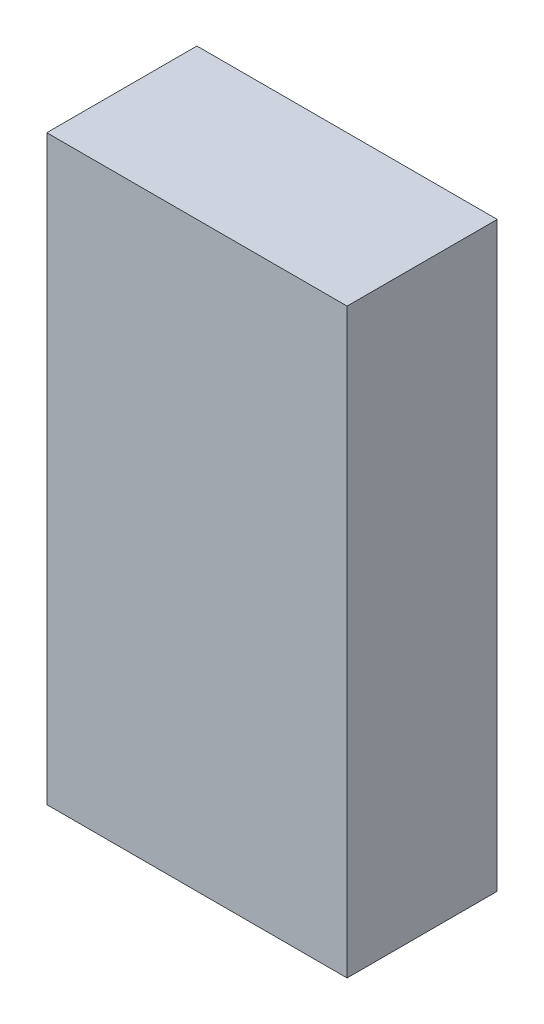
ISO-10303-21;
HEADER;
FILE_DESCRIPTION(('STEP AP214'),'2;1');
FILE_NAME('part.step','',(''),(''),'','','');
FILE_SCHEMA(('AUTOMOTIVE_DESIGN { 1 0 10303 214 1 1 1 1 }'));
ENDSEC;
DATA;
#1=APPLICATION_CONTEXT('core data for automotive mechanical design processes');
#2=APPLICATION_PROTOCOL_DEFINITION('international standard','automotive_design',2000,#1);
#3=PRODUCT_CONTEXT('',#1,'mechanical');
#4=PRODUCT('Part','Part','',(#3));
#5=PRODUCT_RELATED_PRODUCT_CATEGORY('part','',(#4));
#6=PRODUCT_DEFINITION_FORMATION('','',#4);
#7=PRODUCT_DEFINITION_CONTEXT('part definition',#1,'design');
#8=PRODUCT_DEFINITION('design','',#6,#7);
#9=PRODUCT_DEFINITION_SHAPE('','',#8);
#10=(LENGTH_UNIT() NAMED_UNIT(*) SI_UNIT(.MILLI.,.METRE.));
#11=(NAMED_UNIT(*) PLANE_ANGLE_UNIT() SI_UNIT($,.RADIAN.));
#12=(NAMED_UNIT(*) SI_UNIT($,.STERADIAN.) SOLID_ANGLE_UNIT());
#13=UNCERTAINTY_MEASURE_WITH_UNIT(LENGTH_MEASURE(1.E-05),#10,'distance_accuracy_value','');
#14=(GEOMETRIC_REPRESENTATION_CONTEXT(3) GLOBAL_UNCERTAINTY_ASSIGNED_CONTEXT((#13)) GLOBAL_UNIT_ASSIGNED_CONTEXT((#10,
#11,#12)) REPRESENTATION_CONTEXT('',''));
#15=CARTESIAN_POINT('',(0.,0.,0.));
#16=DIRECTION('',(0.,0.,1.));
#17=DIRECTION('',(1.,0.,0.));
#18=AXIS2_PLACEMENT_3D('',#15,#16,#17);
#19=CARTESIAN_POINT('',(0.,98.425,0.));
#20=DIRECTION('',(1.,0.,0.));
#21=DIRECTION('',(0.,0.,-1.));
#22=AXIS2_PLACEMENT_3D('',#19,#20,#21);
#23=PLANE('',#22);
#24=DIRECTION('',(0.,0.,1.));
#25=VECTOR('',#24,1.);
#26=CARTESIAN_POINT('',(0.,0.,0.));
#27=LINE('',#26,#25);
#28=CARTESIAN_POINT('',(0.,0.,-25.4));
#29=VERTEX_POINT('',#28);
#30=CARTESIAN_POINT('',(0.,0.,0.));
#31=VERTEX_POINT('',#30);
#32=EDGE_CURVE('E95',#29,#31,#27,.T.);
#33=ORIENTED_EDGE('',*,*,#32,.T.);
#34=DIRECTION('',(0.,-1.,0.));
#35=VECTOR('',#34,1.);
#36=CARTESIAN_POINT('',(0.,98.425,0.));
#37=LINE('',#36,#35);
#38=CARTESIAN_POINT('',(0.,98.425,0.));
#39=VERTEX_POINT('',#38);
#40=EDGE_CURVE('E11',#39,#31,#37,.T.);
#41=ORIENTED_EDGE('',*,*,#40,.F.);
#42=DIRECTION('',(0.,0.,1.));
#43=VECTOR('',#42,1.);
#44=CARTESIAN_POINT('',(0.,98.425,0.));
#45=LINE('',#44,#43);
#46=CARTESIAN_POINT('',(0.,98.425,-25.4));
#47=VERTEX_POINT('',#46);
#48=EDGE_CURVE('E83',#47,#39,#45,.T.);
#49=ORIENTED_EDGE('',*,*,#48,.F.);
#50=DIRECTION('',(0.,-1.,0.));
#51=VECTOR('',#50,1.);
#52=CARTESIAN_POINT('',(0.,98.425,-25.4));
#53=LINE('',#52,#51);
#54=EDGE_CURVE('E91',#47,#29,#53,.T.);
#55=ORIENTED_EDGE('',*,*,#54,.T.);
#56=EDGE_LOOP('',(#33,#41,#49,#55));
#57=FACE_BOUND('',#56,.T.);
#58=ADVANCED_FACE('F32',(#57),#23,.F.);
#59=CARTESIAN_POINT('',(0.,98.425,0.));
#60=DIRECTION('',(0.,0.,-1.));
#61=DIRECTION('',(-1.,0.,0.));
#62=AXIS2_PLACEMENT_3D('',#59,#60,#61);
#63=PLANE('',#62);
#64=DIRECTION('',(1.,0.,0.));
#65=VECTOR('',#64,1.);
#66=CARTESIAN_POINT('',(0.,0.,0.));
#67=LINE('',#66,#65);
#68=CARTESIAN_POINT('',(50.8,0.,0.));
#69=VERTEX_POINT('',#68);
#70=EDGE_CURVE('E87',#31,#69,#67,.T.);
#71=ORIENTED_EDGE('',*,*,#70,.T.);
#72=DIRECTION('',(0.,-1.,0.));
#73=VECTOR('',#72,1.);
#74=CARTESIAN_POINT('',(50.8,98.425,0.));
#75=LINE('',#74,#73);
#76=CARTESIAN_POINT('',(50.8,98.425,0.));
#77=VERTEX_POINT('',#76);
#78=EDGE_CURVE('E40',#77,#69,#75,.T.);
#79=ORIENTED_EDGE('',*,*,#78,.F.);
#80=DIRECTION('',(1.,0.,0.));
#81=VECTOR('',#80,1.);
#82=CARTESIAN_POINT('',(0.,98.425,0.));
#83=LINE('',#82,#81);
#84=EDGE_CURVE('E78',#39,#77,#83,.T.);
#85=ORIENTED_EDGE('',*,*,#84,.F.);
#86=ORIENTED_EDGE('',*,*,#40,.T.);
#87=EDGE_LOOP('',(#71,#79,#85,#86));
#88=FACE_BOUND('',#87,.T.);
#89=ADVANCED_FACE('F86',(#88),#63,.F.);
#90=CARTESIAN_POINT('',(50.8,98.425,0.));
#91=DIRECTION('',(-1.,0.,0.));
#92=DIRECTION('',(0.,0.,1.));
#93=AXIS2_PLACEMENT_3D('',#90,#91,#92);
#94=PLANE('',#93);
#95=DIRECTION('',(0.,0.,-1.));
#96=VECTOR('',#95,1.);
#97=CARTESIAN_POINT('',(50.8,0.,0.));
#98=LINE('',#97,#96);
#99=CARTESIAN_POINT('',(50.8,0.,-25.4));
#100=VERTEX_POINT('',#99);
#101=EDGE_CURVE('E65',#69,#100,#98,.T.);
#102=ORIENTED_EDGE('',*,*,#101,.T.);
#103=DIRECTION('',(0.,-1.,0.));
#104=VECTOR('',#103,1.);
#105=CARTESIAN_POINT('',(50.8,98.425,-25.4));
#106=LINE('',#105,#104);
#107=CARTESIAN_POINT('',(50.8,98.425,-25.4));
#108=VERTEX_POINT('',#107);
#109=EDGE_CURVE('E88',#108,#100,#106,.T.);
#110=ORIENTED_EDGE('',*,*,#109,.F.);
#111=DIRECTION('',(0.,0.,-1.));
#112=VECTOR('',#111,1.);
#113=CARTESIAN_POINT('',(50.8,98.425,0.));
#114=LINE('',#113,#112);
#115=EDGE_CURVE('E81',#77,#108,#114,.T.);
#116=ORIENTED_EDGE('',*,*,#115,.F.);
#117=ORIENTED_EDGE('',*,*,#78,.T.);
#118=EDGE_LOOP('',(#102,#110,#116,#117));
#119=FACE_BOUND('',#118,.T.);
#120=ADVANCED_FACE('F89',(#119),#94,.F.);
#121=CARTESIAN_POINT('',(0.,98.425,-25.4));
#122=DIRECTION('',(0.,0.,1.));
#123=DIRECTION('',(1.,0.,0.));
#124=AXIS2_PLACEMENT_3D('',#121,#122,#123);
#125=PLANE('',#124);
#126=CARTESIAN_POINT('',(25.4,85.725,-25.4));
#127=DIRECTION('',(0.,0.,-1.));
#128=DIRECTION('',(-1.,0.,0.));
#129=AXIS2_PLACEMENT_3D('',#126,#127,#128);
#130=CIRCLE('',#129,4.826);
#131=CARTESIAN_POINT('',(20.574,85.725,-25.4));
#132=VERTEX_POINT('',#131);
#133=EDGE_CURVE('E121',#132,#132,#130,.T.);
#134=ORIENTED_EDGE('',*,*,#133,.F.);
#135=EDGE_LOOP('',(#134));
#136=FACE_BOUND('',#135,.T.);
#137=DIRECTION('',(-1.,0.,0.));
#138=VECTOR('',#137,1.);
#139=CARTESIAN_POINT('',(0.,0.,-25.4));
#140=LINE('',#139,#138);
#141=EDGE_CURVE('E71',#100,#29,#140,.T.);
#142=ORIENTED_EDGE('',*,*,#141,.T.);
#143=ORIENTED_EDGE('',*,*,#54,.F.);
#144=DIRECTION('',(-1.,0.,0.));
#145=VECTOR('',#144,1.);
#146=CARTESIAN_POINT('',(0.,98.425,-25.4));
#147=LINE('',#146,#145);
#148=EDGE_CURVE('E48',#108,#47,#147,.T.);
#149=ORIENTED_EDGE('',*,*,#148,.F.);
#150=ORIENTED_EDGE('',*,*,#109,.T.);
#151=EDGE_LOOP('',(#142,#143,#149,#150));
#152=FACE_BOUND('',#151,.T.);
#153=ADVANCED_FACE('F103',(#136,#152),#125,.F.);
#154=CARTESIAN_POINT('',(0.,98.425,0.));
#155=DIRECTION('',(0.,-1.,0.));
#156=DIRECTION('',(0.,0.,-1.));
#157=AXIS2_PLACEMENT_3D('',#154,#155,#156);
#158=PLANE('',#157);
#159=ORIENTED_EDGE('',*,*,#48,.T.);
#160=ORIENTED_EDGE('',*,*,#84,.T.);
#161=ORIENTED_EDGE('',*,*,#115,.T.);
#162=ORIENTED_EDGE('',*,*,#148,.T.);
#163=EDGE_LOOP('',(#159,#160,#161,#162));
#164=FACE_BOUND('',#163,.T.);
#165=ADVANCED_FACE('F79',(#164),#158,.F.);
#166=CARTESIAN_POINT('',(0.,0.,0.));
#167=DIRECTION('',(0.,-1.,0.));
#168=DIRECTION('',(0.,0.,-1.));
#169=AXIS2_PLACEMENT_3D('',#166,#167,#168);
#170=PLANE('',#169);
#171=CARTESIAN_POINT('',(38.1,0.,-12.7));
#172=DIRECTION('',(0.,-1.,0.));
#173=DIRECTION('',(0.,0.,-1.));
#174=AXIS2_PLACEMENT_3D('',#171,#172,#173);
#175=CIRCLE('',#174,2.667);
#176=CARTESIAN_POINT('',(38.1,0.,-15.367));
#177=VERTEX_POINT('',#176);
#178=EDGE_CURVE('E115',#177,#177,#175,.T.);
#179=ORIENTED_EDGE('',*,*,#178,.F.);
#180=EDGE_LOOP('',(#179));
#181=FACE_BOUND('',#180,.T.);
#182=CARTESIAN_POINT('',(12.7,0.,-12.7));
#183=DIRECTION('',(0.,-1.,0.));
#184=DIRECTION('',(0.,0.,-1.));
#185=AXIS2_PLACEMENT_3D('',#182,#183,#184);
#186=CIRCLE('',#185,2.667);
#187=CARTESIAN_POINT('',(12.7,0.,-15.367));
#188=VERTEX_POINT('',#187);
#189=EDGE_CURVE('E109',#188,#188,#186,.T.);
#190=ORIENTED_EDGE('',*,*,#189,.F.);
#191=EDGE_LOOP('',(#190));
#192=FACE_BOUND('',#191,.T.);
#193=ORIENTED_EDGE('',*,*,#32,.F.);
#194=ORIENTED_EDGE('',*,*,#141,.F.);
#195=ORIENTED_EDGE('',*,*,#101,.F.);
#196=ORIENTED_EDGE('',*,*,#70,.F.);
#197=EDGE_LOOP('',(#193,#194,#195,#196));
#198=FACE_BOUND('',#197,.T.);
#199=ADVANCED_FACE('F106',(#181,#192,#198),#170,.T.);
#200=CARTESIAN_POINT('',(12.7,19.05,-12.7));
#201=DIRECTION('',(0.,-1.,0.));
#202=DIRECTION('',(0.,0.,-1.));
#203=AXIS2_PLACEMENT_3D('',#200,#201,#202);
#204=CYLINDRICAL_SURFACE('',#203,2.667);
#205=CARTESIAN_POINT('',(12.7,19.05,-12.7));
#206=DIRECTION('',(0.,-1.,0.));
#207=DIRECTION('',(0.,0.,-1.));
#208=AXIS2_PLACEMENT_3D('',#205,#206,#207);
#209=CIRCLE('',#208,2.667);
#210=CARTESIAN_POINT('',(12.7,19.05,-15.367));
#211=VERTEX_POINT('',#210);
#212=EDGE_CURVE('E98',#211,#211,#209,.T.);
#213=CARTESIAN_POINT('',(12.7,19.05,-15.367));
#214=CARTESIAN_POINT('',(12.7,18.8515625,-15.367));
#215=CARTESIAN_POINT('',(12.7,18.653125,-15.367));
#216=CARTESIAN_POINT('',(12.7,18.25625,-15.367));
#217=CARTESIAN_POINT('',(12.7,18.0578125,-15.367));
#218=CARTESIAN_POINT('',(12.7,17.6609375,-15.367));
#219=CARTESIAN_POINT('',(12.7,17.4625,-15.367));
#220=CARTESIAN_POINT('',(12.7,17.065625,-15.367));
#221=CARTESIAN_POINT('',(12.7,16.8671875,-15.367));
#222=CARTESIAN_POINT('',(12.7,16.4703125,-15.367));
#223=CARTESIAN_POINT('',(12.7,16.271875,-15.367));
#224=CARTESIAN_POINT('',(12.7,15.875,-15.367));
#225=CARTESIAN_POINT('',(12.7,15.6765625,-15.367));
#226=CARTESIAN_POINT('',(12.7,15.2796875,-15.367));
#227=CARTESIAN_POINT('',(12.7,15.08125,-15.367));
#228=CARTESIAN_POINT('',(12.7,14.684375,-15.367));
#229=CARTESIAN_POINT('',(12.7,14.4859375,-15.367));
#230=CARTESIAN_POINT('',(12.7,14.0890625,-15.367));
#231=CARTESIAN_POINT('',(12.7,13.890625,-15.367));
#232=CARTESIAN_POINT('',(12.7,13.49375,-15.367));
#233=CARTESIAN_POINT('',(12.7,13.2953125,-15.367));
#234=CARTESIAN_POINT('',(12.7,12.8984375,-15.367));
#235=CARTESIAN_POINT('',(12.7,12.7,-15.367));
#236=CARTESIAN_POINT('',(12.7,12.303125,-15.367));
#237=CARTESIAN_POINT('',(12.7,12.1046875,-15.367));
#238=CARTESIAN_POINT('',(12.7,11.7078125,-15.367));
#239=CARTESIAN_POINT('',(12.7,11.509375,-15.367));
#240=CARTESIAN_POINT('',(12.7,11.1125,-15.367));
#241=CARTESIAN_POINT('',(12.7,10.9140625,-15.367));
#242=CARTESIAN_POINT('',(12.7,10.5171875,-15.367));
#243=CARTESIAN_POINT('',(12.7,10.31875,-15.367));
#244=CARTESIAN_POINT('',(12.7,9.921875,-15.367));
#245=CARTESIAN_POINT('',(12.7,9.7234375,-15.367));
#246=CARTESIAN_POINT('',(12.7,9.3265625,-15.367));
#247=CARTESIAN_POINT('',(12.7,9.128125,-15.367));
#248=CARTESIAN_POINT('',(12.7,8.73125,-15.367));
#249=CARTESIAN_POINT('',(12.7,8.5328125,-15.367));
#250=CARTESIAN_POINT('',(12.7,8.1359375,-15.367));
#251=CARTESIAN_POINT('',(12.7,7.9375,-15.367));
#252=CARTESIAN_POINT('',(12.7,7.540625,-15.367));
#253=CARTESIAN_POINT('',(12.7,7.3421875,-15.367));
#254=CARTESIAN_POINT('',(12.7,6.9453125,-15.367));
#255=CARTESIAN_POINT('',(12.7,6.746875,-15.367));
#256=CARTESIAN_POINT('',(12.7,6.35,-15.367));
#257=CARTESIAN_POINT('',(12.7,6.1515625,-15.367));
#258=CARTESIAN_POINT('',(12.7,5.7546875,-15.367));
#259=CARTESIAN_POINT('',(12.7,5.55625,-15.367));
#260=CARTESIAN_POINT('',(12.7,5.159375,-15.367));
#261=CARTESIAN_POINT('',(12.7,4.9609375,-15.367));
#262=CARTESIAN_POINT('',(12.7,4.5640625,-15.367));
#263=CARTESIAN_POINT('',(12.7,4.365625,-15.367));
#264=CARTESIAN_POINT('',(12.7,3.96875,-15.367));
#265=CARTESIAN_POINT('',(12.7,3.7703125,-15.367));
#266=CARTESIAN_POINT('',(12.7,3.3734375,-15.367));
#267=CARTESIAN_POINT('',(12.7,3.175,-15.367));
#268=CARTESIAN_POINT('',(12.7,2.778125,-15.367));
#269=CARTESIAN_POINT('',(12.7,2.5796875,-15.367));
#270=CARTESIAN_POINT('',(12.7,2.1828125,-15.367));
#271=CARTESIAN_POINT('',(12.7,1.984375,-15.367));
#272=CARTESIAN_POINT('',(12.7,1.5875,-15.367));
#273=CARTESIAN_POINT('',(12.7,1.3890625,-15.367));
#274=CARTESIAN_POINT('',(12.7,0.992187500000001,-15.367));
#275=CARTESIAN_POINT('',(12.7,0.793750000000001,-15.367));
#276=CARTESIAN_POINT('',(12.7,0.396875,-15.367));
#277=CARTESIAN_POINT('',(12.7,0.1984375,-15.367));
#278=CARTESIAN_POINT('',(12.7,0.,-15.367));
#279=B_SPLINE_CURVE_WITH_KNOTS('',3,(#213,#214,#215,#216,#217,#218,#219,#220,#221,#222,#223,
#224,#225,#226,#227,#228,#229,#230,#231,#232,#233,#234,#235,#236,#237,#238,#239,#240,#241,#242,
#243,#244,#245,#246,#247,#248,#249,#250,#251,#252,#253,#254,#255,#256,#257,#258,#259,#260,#261,
#262,#263,#264,#265,#266,#267,#268,#269,#270,#271,#272,#273,#274,#275,#276,#277,#278),
.UNSPECIFIED.,.F.,.F.,(4,2,2,2,2,2,2,2,2,2,2,2,2,2,2,2,2,2,2,2,2,2,2,2,2,2,2,2,2,2,2,2,4),(0.,
0.595312499999997,1.190625,1.7859375,2.38125,2.9765625,3.571875,4.1671875,4.7625,5.3578125,
5.953125,6.5484375,7.14375,7.7390625,8.334375,8.9296875,9.525,10.1203125,10.715625,11.3109375,
11.90625,12.5015625,13.096875,13.6921875,14.2875,14.8828125,15.478125,16.0734375,16.66875,
17.2640625,17.859375,18.4546875,19.05),.UNSPECIFIED.);
#280=EDGE_CURVE('BSEAM171',#211,#188,#279,.T.);
#281=ORIENTED_EDGE('',*,*,#212,.F.);
#282=ORIENTED_EDGE('',*,*,#189,.T.);
#283=ORIENTED_EDGE('',*,*,#280,.T.);
#284=ORIENTED_EDGE('',*,*,#280,.F.);
#285=EDGE_LOOP('',(#281,#283,#282,#284));
#286=FACE_BOUND('',#285,.T.);
#287=ADVANCED_FACE('F171',(#286),#204,.F.);
#288=CARTESIAN_POINT('',(0.,19.05,0.));
#289=DIRECTION('',(0.,-1.,0.));
#290=DIRECTION('',(0.,0.,-1.));
#291=AXIS2_PLACEMENT_3D('',#288,#289,#290);
#292=PLANE('',#291);
#293=ORIENTED_EDGE('',*,*,#212,.T.);
#294=EDGE_LOOP('',(#293));
#295=FACE_BOUND('',#294,.T.);
#296=ADVANCED_FACE('F180',(#295),#292,.T.);
#297=CARTESIAN_POINT('',(38.1,19.05,-12.7));
#298=DIRECTION('',(0.,-1.,0.));
#299=DIRECTION('',(0.,0.,-1.));
#300=AXIS2_PLACEMENT_3D('',#297,#298,#299);
#301=CYLINDRICAL_SURFACE('',#300,2.667);
#302=CARTESIAN_POINT('',(38.1,19.05,-12.7));
#303=DIRECTION('',(0.,-1.,0.));
#304=DIRECTION('',(0.,0.,-1.));
#305=AXIS2_PLACEMENT_3D('',#302,#303,#304);
#306=CIRCLE('',#305,2.667);
#307=CARTESIAN_POINT('',(38.1,19.05,-15.367));
#308=VERTEX_POINT('',#307);
#309=EDGE_CURVE('E112',#308,#308,#306,.T.);
#310=CARTESIAN_POINT('',(38.1,19.05,-15.367));
#311=CARTESIAN_POINT('',(38.1,18.8515625,-15.367));
#312=CARTESIAN_POINT('',(38.1,18.653125,-15.367));
#313=CARTESIAN_POINT('',(38.1,18.25625,-15.367));
#314=CARTESIAN_POINT('',(38.1,18.0578125,-15.367));
#315=CARTESIAN_POINT('',(38.1,17.6609375,-15.367));
#316=CARTESIAN_POINT('',(38.1,17.4625,-15.367));
#317=CARTESIAN_POINT('',(38.1,17.065625,-15.367));
#318=CARTESIAN_POINT('',(38.1,16.8671875,-15.367));
#319=CARTESIAN_POINT('',(38.1,16.4703125,-15.367));
#320=CARTESIAN_POINT('',(38.1,16.271875,-15.367));
#321=CARTESIAN_POINT('',(38.1,15.875,-15.367));
#322=CARTESIAN_POINT('',(38.1,15.6765625,-15.367));
#323=CARTESIAN_POINT('',(38.1,15.2796875,-15.367));
#324=CARTESIAN_POINT('',(38.1,15.08125,-15.367));
#325=CARTESIAN_POINT('',(38.1,14.684375,-15.367));
#326=CARTESIAN_POINT('',(38.1,14.4859375,-15.367));
#327=CARTESIAN_POINT('',(38.1,14.0890625,-15.367));
#328=CARTESIAN_POINT('',(38.1,13.890625,-15.367));
#329=CARTESIAN_POINT('',(38.1,13.49375,-15.367));
#330=CARTESIAN_POINT('',(38.1,13.2953125,-15.367));
#331=CARTESIAN_POINT('',(38.1,12.8984375,-15.367));
#332=CARTESIAN_POINT('',(38.1,12.7,-15.367));
#333=CARTESIAN_POINT('',(38.1,12.303125,-15.367));
#334=CARTESIAN_POINT('',(38.1,12.1046875,-15.367));
#335=CARTESIAN_POINT('',(38.1,11.7078125,-15.367));
#336=CARTESIAN_POINT('',(38.1,11.509375,-15.367));
#337=CARTESIAN_POINT('',(38.1,11.1125,-15.367));
#338=CARTESIAN_POINT('',(38.1,10.9140625,-15.367));
#339=CARTESIAN_POINT('',(38.1,10.5171875,-15.367));
#340=CARTESIAN_POINT('',(38.1,10.31875,-15.367));
#341=CARTESIAN_POINT('',(38.1,9.921875,-15.367));
#342=CARTESIAN_POINT('',(38.1,9.7234375,-15.367));
#343=CARTESIAN_POINT('',(38.1,9.3265625,-15.367));
#344=CARTESIAN_POINT('',(38.1,9.128125,-15.367));
#345=CARTESIAN_POINT('',(38.1,8.73125,-15.367));
#346=CARTESIAN_POINT('',(38.1,8.5328125,-15.367));
#347=CARTESIAN_POINT('',(38.1,8.1359375,-15.367));
#348=CARTESIAN_POINT('',(38.1,7.9375,-15.367));
#349=CARTESIAN_POINT('',(38.1,7.540625,-15.367));
#350=CARTESIAN_POINT('',(38.1,7.3421875,-15.367));
#351=CARTESIAN_POINT('',(38.1,6.9453125,-15.367));
#352=CARTESIAN_POINT('',(38.1,6.746875,-15.367));
#353=CARTESIAN_POINT('',(38.1,6.35,-15.367));
#354=CARTESIAN_POINT('',(38.1,6.1515625,-15.367));
#355=CARTESIAN_POINT('',(38.1,5.7546875,-15.367));
#356=CARTESIAN_POINT('',(38.1,5.55625,-15.367));
#357=CARTESIAN_POINT('',(38.1,5.159375,-15.367));
#358=CARTESIAN_POINT('',(38.1,4.9609375,-15.367));
#359=CARTESIAN_POINT('',(38.1,4.5640625,-15.367));
#360=CARTESIAN_POINT('',(38.1,4.365625,-15.367));
#361=CARTESIAN_POINT('',(38.1,3.96875,-15.367));
#362=CARTESIAN_POINT('',(38.1,3.7703125,-15.367));
#363=CARTESIAN_POINT('',(38.1,3.3734375,-15.367));
#364=CARTESIAN_POINT('',(38.1,3.175,-15.367));
#365=CARTESIAN_POINT('',(38.1,2.778125,-15.367));
#366=CARTESIAN_POINT('',(38.1,2.5796875,-15.367));
#367=CARTESIAN_POINT('',(38.1,2.1828125,-15.367));
#368=CARTESIAN_POINT('',(38.1,1.984375,-15.367));
#369=CARTESIAN_POINT('',(38.1,1.5875,-15.367));
#370=CARTESIAN_POINT('',(38.1,1.3890625,-15.367));
#371=CARTESIAN_POINT('',(38.1,0.992187500000001,-15.367));
#372=CARTESIAN_POINT('',(38.1,0.793750000000001,-15.367));
#373=CARTESIAN_POINT('',(38.1,0.396875,-15.367));
#374=CARTESIAN_POINT('',(38.1,0.1984375,-15.367));
#375=CARTESIAN_POINT('',(38.1,0.,-15.367));
#376=B_SPLINE_CURVE_WITH_KNOTS('',3,(#310,#311,#312,#313,#314,#315,#316,#317,#318,#319,#320,
#321,#322,#323,#324,#325,#326,#327,#328,#329,#330,#331,#332,#333,#334,#335,#336,#337,#338,#339,
#340,#341,#342,#343,#344,#345,#346,#347,#348,#349,#350,#351,#352,#353,#354,#355,#356,#357,#358,
#359,#360,#361,#362,#363,#364,#365,#366,#367,#368,#369,#370,#371,#372,#373,#374,#375),
.UNSPECIFIED.,.F.,.F.,(4,2,2,2,2,2,2,2,2,2,2,2,2,2,2,2,2,2,2,2,2,2,2,2,2,2,2,2,2,2,2,2,4),(0.,
0.595312499999997,1.190625,1.7859375,2.38125,2.9765625,3.571875,4.1671875,4.7625,5.3578125,
5.953125,6.5484375,7.14375,7.7390625,8.334375,8.9296875,9.525,10.1203125,10.715625,11.3109375,
11.90625,12.5015625,13.096875,13.6921875,14.2875,14.8828125,15.478125,16.0734375,16.66875,
17.2640625,17.859375,18.4546875,19.05),.UNSPECIFIED.);
#377=EDGE_CURVE('BSEAM190',#308,#177,#376,.T.);
#378=ORIENTED_EDGE('',*,*,#309,.F.);
#379=ORIENTED_EDGE('',*,*,#178,.T.);
#380=ORIENTED_EDGE('',*,*,#377,.T.);
#381=ORIENTED_EDGE('',*,*,#377,.F.);
#382=EDGE_LOOP('',(#378,#380,#379,#381));
#383=FACE_BOUND('',#382,.T.);
#384=ADVANCED_FACE('F190',(#383),#301,.F.);
#385=CARTESIAN_POINT('',(0.,19.05,0.));
#386=DIRECTION('',(0.,-1.,0.));
#387=DIRECTION('',(0.,0.,-1.));
#388=AXIS2_PLACEMENT_3D('',#385,#386,#387);
#389=PLANE('',#388);
#390=ORIENTED_EDGE('',*,*,#309,.T.);
#391=EDGE_LOOP('',(#390));
#392=FACE_BOUND('',#391,.T.);
#393=ADVANCED_FACE('F132',(#392),#389,.T.);
#394=CARTESIAN_POINT('',(25.4,85.725,-12.7));
#395=DIRECTION('',(0.,0.,-1.));
#396=DIRECTION('',(-1.,0.,0.));
#397=AXIS2_PLACEMENT_3D('',#394,#395,#396);
#398=CYLINDRICAL_SURFACE('',#397,4.826);
#399=CARTESIAN_POINT('',(25.4,85.725,-12.7));
#400=DIRECTION('',(0.,0.,-1.));
#401=DIRECTION('',(-1.,0.,0.));
#402=AXIS2_PLACEMENT_3D('',#399,#400,#401);
#403=CIRCLE('',#402,4.826);
#404=CARTESIAN_POINT('',(20.574,85.725,-12.7));
#405=VERTEX_POINT('',#404);
#406=EDGE_CURVE('E118',#405,#405,#403,.T.);
#407=ORIENTED_EDGE('',*,*,#406,.F.);
#408=EDGE_LOOP('',(#407));
#409=FACE_BOUND('',#408,.T.);
#410=ORIENTED_EDGE('',*,*,#133,.T.);
#411=EDGE_LOOP('',(#410));
#412=FACE_BOUND('',#411,.T.);
#413=ADVANCED_FACE('F129',(#409,#412),#398,.F.);
#414=CARTESIAN_POINT('',(25.4,85.725,-12.7));
#415=DIRECTION('',(0.,0.,-1.));
#416=DIRECTION('',(-1.,0.,0.));
#417=AXIS2_PLACEMENT_3D('',#414,#415,#416);
#418=PLANE('',#417);
#419=ORIENTED_EDGE('',*,*,#406,.T.);
#420=EDGE_LOOP('',(#419));
#421=FACE_BOUND('',#420,.T.);
#422=ADVANCED_FACE('F127',(#421),#418,.T.);
#423=CLOSED_SHELL('',(#58,#89,#120,#153,#165,#199,#287,#296,#384,#393,#413,#422));
#424=MANIFOLD_SOLID_BREP('B2',#423);
#425=ADVANCED_BREP_SHAPE_REPRESENTATION('',(#18,#424),#14);
#426=SHAPE_DEFINITION_REPRESENTATION(#9,#425);
ENDSEC;
END-ISO-10303-21;
